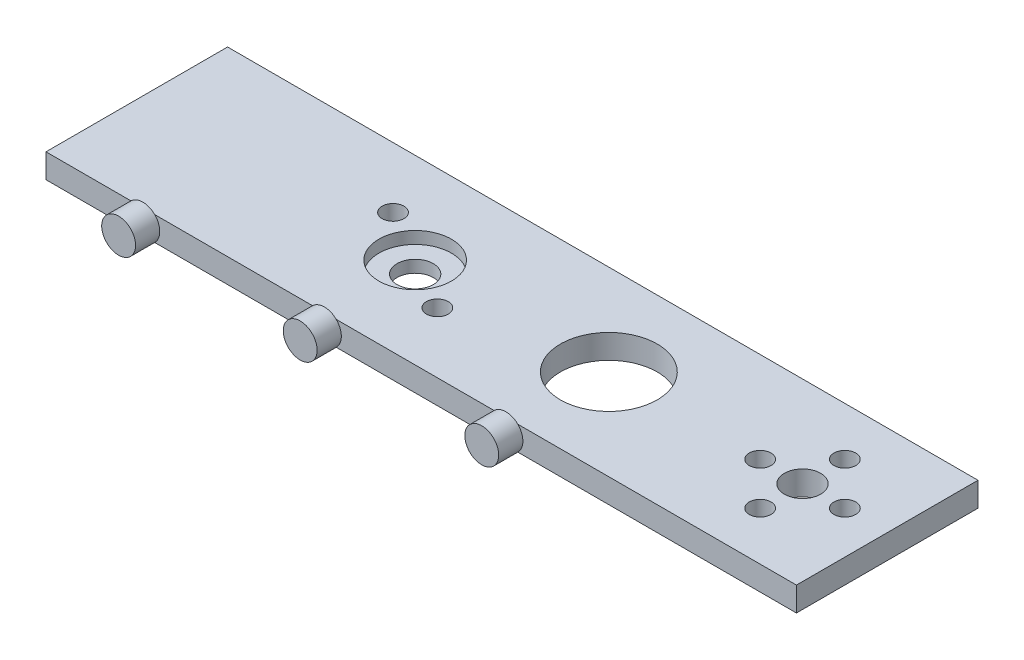
ISO-10303-21;
HEADER;
FILE_DESCRIPTION(('STEP AP214'),'2;1');
FILE_NAME('part.step','',(''),(''),'','','');
FILE_SCHEMA(('AUTOMOTIVE_DESIGN { 1 0 10303 214 1 1 1 1 }'));
ENDSEC;
DATA;
#1=APPLICATION_CONTEXT('core data for automotive mechanical design processes');
#2=APPLICATION_PROTOCOL_DEFINITION('international standard','automotive_design',2000,#1);
#3=PRODUCT_CONTEXT('',#1,'mechanical');
#4=PRODUCT('Part','Part','',(#3));
#5=PRODUCT_RELATED_PRODUCT_CATEGORY('part','',(#4));
#6=PRODUCT_DEFINITION_FORMATION('','',#4);
#7=PRODUCT_DEFINITION_CONTEXT('part definition',#1,'design');
#8=PRODUCT_DEFINITION('design','',#6,#7);
#9=PRODUCT_DEFINITION_SHAPE('','',#8);
#10=(LENGTH_UNIT() NAMED_UNIT(*) SI_UNIT(.MILLI.,.METRE.));
#11=(NAMED_UNIT(*) PLANE_ANGLE_UNIT() SI_UNIT($,.RADIAN.));
#12=(NAMED_UNIT(*) SI_UNIT($,.STERADIAN.) SOLID_ANGLE_UNIT());
#13=UNCERTAINTY_MEASURE_WITH_UNIT(LENGTH_MEASURE(1.E-05),#10,'distance_accuracy_value','');
#14=(GEOMETRIC_REPRESENTATION_CONTEXT(3) GLOBAL_UNCERTAINTY_ASSIGNED_CONTEXT((#13)) GLOBAL_UNIT_ASSIGNED_CONTEXT((#10,
#11,#12)) REPRESENTATION_CONTEXT('',''));
#15=CARTESIAN_POINT('',(0.,0.,0.));
#16=DIRECTION('',(0.,0.,1.));
#17=DIRECTION('',(1.,0.,0.));
#18=AXIS2_PLACEMENT_3D('',#15,#16,#17);
#19=CARTESIAN_POINT('',(-8.,2.,0.));
#20=DIRECTION('',(0.,-1.,0.));
#21=DIRECTION('',(0.,0.,-1.));
#22=AXIS2_PLACEMENT_3D('',#19,#20,#21);
#23=CYLINDRICAL_SURFACE('',#22,1.5);
#24=CARTESIAN_POINT('',(-8.,0.,0.));
#25=DIRECTION('',(0.,1.,0.));
#26=DIRECTION('',(0.,0.,1.));
#27=AXIS2_PLACEMENT_3D('',#24,#25,#26);
#28=CIRCLE('',#27,1.5);
#29=CARTESIAN_POINT('',(-8.,0.,1.5));
#30=VERTEX_POINT('',#29);
#31=EDGE_CURVE('E250',#30,#30,#28,.T.);
#32=ORIENTED_EDGE('',*,*,#31,.F.);
#33=EDGE_LOOP('',(#32));
#34=FACE_BOUND('',#33,.T.);
#35=CARTESIAN_POINT('',(-8.,1.,0.));
#36=DIRECTION('',(0.,1.,0.));
#37=DIRECTION('',(0.,0.,1.));
#38=AXIS2_PLACEMENT_3D('',#35,#36,#37);
#39=CIRCLE('',#38,1.5);
#40=CARTESIAN_POINT('',(-8.,1.,1.5));
#41=VERTEX_POINT('',#40);
#42=EDGE_CURVE('E51',#41,#41,#39,.T.);
#43=ORIENTED_EDGE('',*,*,#42,.T.);
#44=EDGE_LOOP('',(#43));
#45=FACE_BOUND('',#44,.T.);
#46=ADVANCED_FACE('F47',(#34,#45),#23,.F.);
#47=CARTESIAN_POINT('',(0.,2.,7.5));
#48=DIRECTION('',(0.,0.,1.));
#49=DIRECTION('',(1.,0.,0.));
#50=AXIS2_PLACEMENT_3D('',#47,#48,#49);
#51=PLANE('',#50);
#52=CARTESIAN_POINT('',(-23.,1.,7.5));
#53=DIRECTION('',(0.,0.,1.));
#54=DIRECTION('',(1.,0.,0.));
#55=AXIS2_PLACEMENT_3D('',#52,#53,#54);
#56=CIRCLE('',#55,1.4);
#57=CARTESIAN_POINT('',(-23.9797958971133,2.,7.5));
#58=VERTEX_POINT('',#57);
#59=CARTESIAN_POINT('',(-23.9797958971133,0.,7.5));
#60=VERTEX_POINT('',#59);
#61=EDGE_CURVE('E11',#58,#60,#56,.T.);
#62=ORIENTED_EDGE('',*,*,#61,.F.);
#63=DIRECTION('',(-1.,0.,0.));
#64=VECTOR('',#63,1.);
#65=CARTESIAN_POINT('',(0.,2.,7.5));
#66=LINE('',#65,#64);
#67=CARTESIAN_POINT('',(-31.,2.,7.5));
#68=VERTEX_POINT('',#67);
#69=EDGE_CURVE('E140',#58,#68,#66,.T.);
#70=ORIENTED_EDGE('',*,*,#69,.T.);
#71=DIRECTION('',(0.,-1.,0.));
#72=VECTOR('',#71,1.);
#73=CARTESIAN_POINT('',(-31.,2.,7.5));
#74=LINE('',#73,#72);
#75=CARTESIAN_POINT('',(-31.,0.,7.5));
#76=VERTEX_POINT('',#75);
#77=EDGE_CURVE('E161',#68,#76,#74,.T.);
#78=ORIENTED_EDGE('',*,*,#77,.T.);
#79=DIRECTION('',(-1.,0.,0.));
#80=VECTOR('',#79,1.);
#81=CARTESIAN_POINT('',(0.,0.,7.5));
#82=LINE('',#81,#80);
#83=EDGE_CURVE('E258',#60,#76,#82,.T.);
#84=ORIENTED_EDGE('',*,*,#83,.F.);
#85=EDGE_LOOP('',(#62,#70,#78,#84));
#86=FACE_BOUND('',#85,.T.);
#87=ADVANCED_FACE('F284',(#86),#51,.T.);
#88=CARTESIAN_POINT('',(-22.0202041028867,0.,7.5));
#89=VERTEX_POINT('',#88);
#90=CARTESIAN_POINT('',(-22.0202041028867,2.,7.5));
#91=VERTEX_POINT('',#90);
#92=EDGE_CURVE('E57',#89,#91,#56,.T.);
#93=ORIENTED_EDGE('',*,*,#92,.F.);
#94=CARTESIAN_POINT('',(-8.97979589711327,0.,7.5));
#95=VERTEX_POINT('',#94);
#96=EDGE_CURVE('E310',#95,#89,#82,.T.);
#97=ORIENTED_EDGE('',*,*,#96,.F.);
#98=CARTESIAN_POINT('',(-8.,1.,7.5));
#99=DIRECTION('',(0.,0.,1.));
#100=DIRECTION('',(1.,0.,0.));
#101=AXIS2_PLACEMENT_3D('',#98,#99,#100);
#102=CIRCLE('',#101,1.4);
#103=CARTESIAN_POINT('',(-8.97979589711327,2.,7.5));
#104=VERTEX_POINT('',#103);
#105=EDGE_CURVE('E72',#104,#95,#102,.T.);
#106=ORIENTED_EDGE('',*,*,#105,.F.);
#107=EDGE_CURVE('E347',#104,#91,#66,.T.);
#108=ORIENTED_EDGE('',*,*,#107,.T.);
#109=EDGE_LOOP('',(#93,#97,#106,#108));
#110=FACE_BOUND('',#109,.T.);
#111=ADVANCED_FACE('F360',(#110),#51,.T.);
#112=CARTESIAN_POINT('',(-7.02020410288673,0.,7.5));
#113=VERTEX_POINT('',#112);
#114=CARTESIAN_POINT('',(-7.02020410288673,2.,7.5));
#115=VERTEX_POINT('',#114);
#116=EDGE_CURVE('E331',#113,#115,#102,.T.);
#117=ORIENTED_EDGE('',*,*,#116,.F.);
#118=CARTESIAN_POINT('',(6.02020410288673,0.,7.5));
#119=VERTEX_POINT('',#118);
#120=EDGE_CURVE('E304',#119,#113,#82,.T.);
#121=ORIENTED_EDGE('',*,*,#120,.F.);
#122=CARTESIAN_POINT('',(7.,1.,7.5));
#123=DIRECTION('',(0.,0.,1.));
#124=DIRECTION('',(1.,0.,0.));
#125=AXIS2_PLACEMENT_3D('',#122,#123,#124);
#126=CIRCLE('',#125,1.4);
#127=CARTESIAN_POINT('',(6.02020410288673,2.,7.5));
#128=VERTEX_POINT('',#127);
#129=EDGE_CURVE('E160',#128,#119,#126,.T.);
#130=ORIENTED_EDGE('',*,*,#129,.F.);
#131=EDGE_CURVE('E147',#128,#115,#66,.T.);
#132=ORIENTED_EDGE('',*,*,#131,.T.);
#133=EDGE_LOOP('',(#117,#121,#130,#132));
#134=FACE_BOUND('',#133,.T.);
#135=ADVANCED_FACE('F342',(#134),#51,.T.);
#136=CARTESIAN_POINT('',(-31.,2.,0.));
#137=DIRECTION('',(-1.,0.,0.));
#138=DIRECTION('',(0.,0.,1.));
#139=AXIS2_PLACEMENT_3D('',#136,#137,#138);
#140=PLANE('',#139);
#141=DIRECTION('',(0.,0.,-1.));
#142=VECTOR('',#141,1.);
#143=CARTESIAN_POINT('',(-31.,0.,0.));
#144=LINE('',#143,#142);
#145=CARTESIAN_POINT('',(-31.,0.,-7.5));
#146=VERTEX_POINT('',#145);
#147=EDGE_CURVE('E254',#76,#146,#144,.T.);
#148=ORIENTED_EDGE('',*,*,#147,.F.);
#149=ORIENTED_EDGE('',*,*,#77,.F.);
#150=DIRECTION('',(0.,0.,-1.));
#151=VECTOR('',#150,1.);
#152=CARTESIAN_POINT('',(-31.,2.,0.));
#153=LINE('',#152,#151);
#154=CARTESIAN_POINT('',(-31.,2.,-7.5));
#155=VERTEX_POINT('',#154);
#156=EDGE_CURVE('E206',#68,#155,#153,.T.);
#157=ORIENTED_EDGE('',*,*,#156,.T.);
#158=DIRECTION('',(0.,-1.,0.));
#159=VECTOR('',#158,1.);
#160=CARTESIAN_POINT('',(-31.,2.,-7.5));
#161=LINE('',#160,#159);
#162=EDGE_CURVE('E220',#155,#146,#161,.T.);
#163=ORIENTED_EDGE('',*,*,#162,.T.);
#164=EDGE_LOOP('',(#148,#149,#157,#163));
#165=FACE_BOUND('',#164,.T.);
#166=ADVANCED_FACE('F287',(#165),#140,.T.);
#167=CARTESIAN_POINT('',(7.97979589711327,0.,7.5));
#168=VERTEX_POINT('',#167);
#169=CARTESIAN_POINT('',(7.97979589711327,2.,7.5));
#170=VERTEX_POINT('',#169);
#171=EDGE_CURVE('E130',#168,#170,#126,.T.);
#172=ORIENTED_EDGE('',*,*,#171,.F.);
#173=CARTESIAN_POINT('',(31.,0.,7.5));
#174=VERTEX_POINT('',#173);
#175=EDGE_CURVE('E259',#174,#168,#82,.T.);
#176=ORIENTED_EDGE('',*,*,#175,.F.);
#177=DIRECTION('',(0.,-1.,0.));
#178=VECTOR('',#177,1.);
#179=CARTESIAN_POINT('',(31.,2.,7.5));
#180=LINE('',#179,#178);
#181=CARTESIAN_POINT('',(31.,2.,7.5));
#182=VERTEX_POINT('',#181);
#183=EDGE_CURVE('E132',#182,#174,#180,.T.);
#184=ORIENTED_EDGE('',*,*,#183,.F.);
#185=EDGE_CURVE('E125',#182,#170,#66,.T.);
#186=ORIENTED_EDGE('',*,*,#185,.T.);
#187=EDGE_LOOP('',(#172,#176,#184,#186));
#188=FACE_BOUND('',#187,.T.);
#189=ADVANCED_FACE('F127',(#188),#51,.T.);
#190=CARTESIAN_POINT('',(31.,2.,0.));
#191=DIRECTION('',(1.,0.,0.));
#192=DIRECTION('',(0.,0.,-1.));
#193=AXIS2_PLACEMENT_3D('',#190,#191,#192);
#194=PLANE('',#193);
#195=DIRECTION('',(0.,0.,1.));
#196=VECTOR('',#195,1.);
#197=CARTESIAN_POINT('',(31.,0.,0.));
#198=LINE('',#197,#196);
#199=CARTESIAN_POINT('',(31.,0.,-7.5));
#200=VERTEX_POINT('',#199);
#201=EDGE_CURVE('E262',#200,#174,#198,.T.);
#202=ORIENTED_EDGE('',*,*,#201,.F.);
#203=DIRECTION('',(0.,-1.,0.));
#204=VECTOR('',#203,1.);
#205=CARTESIAN_POINT('',(31.,2.,-7.5));
#206=LINE('',#205,#204);
#207=CARTESIAN_POINT('',(31.,2.,-7.5));
#208=VERTEX_POINT('',#207);
#209=EDGE_CURVE('E276',#208,#200,#206,.T.);
#210=ORIENTED_EDGE('',*,*,#209,.F.);
#211=DIRECTION('',(0.,0.,1.));
#212=VECTOR('',#211,1.);
#213=CARTESIAN_POINT('',(31.,2.,0.));
#214=LINE('',#213,#212);
#215=EDGE_CURVE('E137',#208,#182,#214,.T.);
#216=ORIENTED_EDGE('',*,*,#215,.T.);
#217=ORIENTED_EDGE('',*,*,#183,.T.);
#218=EDGE_LOOP('',(#202,#210,#216,#217));
#219=FACE_BOUND('',#218,.T.);
#220=ADVANCED_FACE('F297',(#219),#194,.T.);
#221=CARTESIAN_POINT('',(0.,2.,-7.5));
#222=DIRECTION('',(0.,0.,-1.));
#223=DIRECTION('',(-1.,0.,0.));
#224=AXIS2_PLACEMENT_3D('',#221,#222,#223);
#225=PLANE('',#224);
#226=DIRECTION('',(1.,0.,0.));
#227=VECTOR('',#226,1.);
#228=CARTESIAN_POINT('',(0.,0.,-7.5));
#229=LINE('',#228,#227);
#230=EDGE_CURVE('E267',#146,#200,#229,.T.);
#231=ORIENTED_EDGE('',*,*,#230,.F.);
#232=ORIENTED_EDGE('',*,*,#162,.F.);
#233=DIRECTION('',(1.,0.,0.));
#234=VECTOR('',#233,1.);
#235=CARTESIAN_POINT('',(0.,2.,-7.5));
#236=LINE('',#235,#234);
#237=EDGE_CURVE('E212',#155,#208,#236,.T.);
#238=ORIENTED_EDGE('',*,*,#237,.T.);
#239=ORIENTED_EDGE('',*,*,#209,.T.);
#240=EDGE_LOOP('',(#231,#232,#238,#239));
#241=FACE_BOUND('',#240,.T.);
#242=ADVANCED_FACE('F293',(#241),#225,.T.);
#243=CARTESIAN_POINT('',(8.,2.,0.));
#244=DIRECTION('',(0.,-1.,0.));
#245=DIRECTION('',(0.,0.,-1.));
#246=AXIS2_PLACEMENT_3D('',#243,#244,#245);
#247=CYLINDRICAL_SURFACE('',#246,4.);
#248=CARTESIAN_POINT('',(8.,2.,0.));
#249=DIRECTION('',(0.,1.,0.));
#250=DIRECTION('',(0.,0.,1.));
#251=AXIS2_PLACEMENT_3D('',#248,#249,#250);
#252=CIRCLE('',#251,4.);
#253=CARTESIAN_POINT('',(8.,2.,4.));
#254=VERTEX_POINT('',#253);
#255=EDGE_CURVE('E202',#254,#254,#252,.T.);
#256=ORIENTED_EDGE('',*,*,#255,.T.);
#257=EDGE_LOOP('',(#256));
#258=FACE_BOUND('',#257,.T.);
#259=CARTESIAN_POINT('',(8.,0.,0.));
#260=DIRECTION('',(0.,1.,0.));
#261=DIRECTION('',(0.,0.,1.));
#262=AXIS2_PLACEMENT_3D('',#259,#260,#261);
#263=CIRCLE('',#262,4.);
#264=CARTESIAN_POINT('',(8.,0.,4.));
#265=VERTEX_POINT('',#264);
#266=EDGE_CURVE('E246',#265,#265,#263,.T.);
#267=ORIENTED_EDGE('',*,*,#266,.F.);
#268=EDGE_LOOP('',(#267));
#269=FACE_BOUND('',#268,.T.);
#270=ADVANCED_FACE('F379',(#258,#269),#247,.F.);
#271=CARTESIAN_POINT('',(24.,2.,0.));
#272=DIRECTION('',(0.,-1.,0.));
#273=DIRECTION('',(0.,0.,-1.));
#274=AXIS2_PLACEMENT_3D('',#271,#272,#273);
#275=CYLINDRICAL_SURFACE('',#274,1.5);
#276=CARTESIAN_POINT('',(24.,2.,0.));
#277=DIRECTION('',(0.,1.,0.));
#278=DIRECTION('',(0.,0.,1.));
#279=AXIS2_PLACEMENT_3D('',#276,#277,#278);
#280=CIRCLE('',#279,1.5);
#281=CARTESIAN_POINT('',(24.,2.,1.5));
#282=VERTEX_POINT('',#281);
#283=EDGE_CURVE('E198',#282,#282,#280,.T.);
#284=ORIENTED_EDGE('',*,*,#283,.T.);
#285=EDGE_LOOP('',(#284));
#286=FACE_BOUND('',#285,.T.);
#287=CARTESIAN_POINT('',(24.,0.,0.));
#288=DIRECTION('',(0.,1.,0.));
#289=DIRECTION('',(0.,0.,1.));
#290=AXIS2_PLACEMENT_3D('',#287,#288,#289);
#291=CIRCLE('',#290,1.5);
#292=CARTESIAN_POINT('',(24.,0.,1.5));
#293=VERTEX_POINT('',#292);
#294=EDGE_CURVE('E242',#293,#293,#291,.T.);
#295=ORIENTED_EDGE('',*,*,#294,.F.);
#296=EDGE_LOOP('',(#295));
#297=FACE_BOUND('',#296,.T.);
#298=ADVANCED_FACE('F382',(#286,#297),#275,.F.);
#299=CARTESIAN_POINT('',(27.5,2.,0.));
#300=DIRECTION('',(0.,-1.,0.));
#301=DIRECTION('',(0.,0.,-1.));
#302=AXIS2_PLACEMENT_3D('',#299,#300,#301);
#303=CYLINDRICAL_SURFACE('',#302,0.9);
#304=CARTESIAN_POINT('',(27.5,2.,0.));
#305=DIRECTION('',(0.,1.,0.));
#306=DIRECTION('',(0.,0.,1.));
#307=AXIS2_PLACEMENT_3D('',#304,#305,#306);
#308=CIRCLE('',#307,0.9);
#309=CARTESIAN_POINT('',(27.5,2.,0.9));
#310=VERTEX_POINT('',#309);
#311=EDGE_CURVE('E194',#310,#310,#308,.T.);
#312=ORIENTED_EDGE('',*,*,#311,.T.);
#313=EDGE_LOOP('',(#312));
#314=FACE_BOUND('',#313,.T.);
#315=CARTESIAN_POINT('',(27.5,0.,0.));
#316=DIRECTION('',(0.,1.,0.));
#317=DIRECTION('',(0.,0.,1.));
#318=AXIS2_PLACEMENT_3D('',#315,#316,#317);
#319=CIRCLE('',#318,0.9);
#320=CARTESIAN_POINT('',(27.5,0.,0.9));
#321=VERTEX_POINT('',#320);
#322=EDGE_CURVE('E238',#321,#321,#319,.T.);
#323=ORIENTED_EDGE('',*,*,#322,.F.);
#324=EDGE_LOOP('',(#323));
#325=FACE_BOUND('',#324,.T.);
#326=ADVANCED_FACE('F386',(#314,#325),#303,.F.);
#327=CARTESIAN_POINT('',(24.,2.,3.5));
#328=DIRECTION('',(0.,-1.,0.));
#329=DIRECTION('',(0.,0.,-1.));
#330=AXIS2_PLACEMENT_3D('',#327,#328,#329);
#331=CYLINDRICAL_SURFACE('',#330,0.9);
#332=CARTESIAN_POINT('',(24.,2.,3.5));
#333=DIRECTION('',(0.,1.,0.));
#334=DIRECTION('',(0.,0.,1.));
#335=AXIS2_PLACEMENT_3D('',#332,#333,#334);
#336=CIRCLE('',#335,0.9);
#337=CARTESIAN_POINT('',(24.,2.,4.4));
#338=VERTEX_POINT('',#337);
#339=EDGE_CURVE('E190',#338,#338,#336,.T.);
#340=ORIENTED_EDGE('',*,*,#339,.T.);
#341=EDGE_LOOP('',(#340));
#342=FACE_BOUND('',#341,.T.);
#343=CARTESIAN_POINT('',(24.,0.,3.5));
#344=DIRECTION('',(0.,1.,0.));
#345=DIRECTION('',(0.,0.,1.));
#346=AXIS2_PLACEMENT_3D('',#343,#344,#345);
#347=CIRCLE('',#346,0.9);
#348=CARTESIAN_POINT('',(24.,0.,4.4));
#349=VERTEX_POINT('',#348);
#350=EDGE_CURVE('E234',#349,#349,#347,.T.);
#351=ORIENTED_EDGE('',*,*,#350,.F.);
#352=EDGE_LOOP('',(#351));
#353=FACE_BOUND('',#352,.T.);
#354=ADVANCED_FACE('F390',(#342,#353),#331,.F.);
#355=CARTESIAN_POINT('',(20.5,2.,0.));
#356=DIRECTION('',(0.,-1.,0.));
#357=DIRECTION('',(0.,0.,-1.));
#358=AXIS2_PLACEMENT_3D('',#355,#356,#357);
#359=CYLINDRICAL_SURFACE('',#358,0.9);
#360=CARTESIAN_POINT('',(20.5,2.,0.));
#361=DIRECTION('',(0.,1.,0.));
#362=DIRECTION('',(0.,0.,1.));
#363=AXIS2_PLACEMENT_3D('',#360,#361,#362);
#364=CIRCLE('',#363,0.9);
#365=CARTESIAN_POINT('',(20.5,2.,0.900000000000001));
#366=VERTEX_POINT('',#365);
#367=EDGE_CURVE('E186',#366,#366,#364,.T.);
#368=ORIENTED_EDGE('',*,*,#367,.T.);
#369=EDGE_LOOP('',(#368));
#370=FACE_BOUND('',#369,.T.);
#371=CARTESIAN_POINT('',(20.5,0.,0.));
#372=DIRECTION('',(0.,1.,0.));
#373=DIRECTION('',(0.,0.,1.));
#374=AXIS2_PLACEMENT_3D('',#371,#372,#373);
#375=CIRCLE('',#374,0.9);
#376=CARTESIAN_POINT('',(20.5,0.,0.900000000000001));
#377=VERTEX_POINT('',#376);
#378=EDGE_CURVE('E230',#377,#377,#375,.T.);
#379=ORIENTED_EDGE('',*,*,#378,.F.);
#380=EDGE_LOOP('',(#379));
#381=FACE_BOUND('',#380,.T.);
#382=ADVANCED_FACE('F394',(#370,#381),#359,.F.);
#383=CARTESIAN_POINT('',(24.,2.,-3.5));
#384=DIRECTION('',(0.,-1.,0.));
#385=DIRECTION('',(0.,0.,-1.));
#386=AXIS2_PLACEMENT_3D('',#383,#384,#385);
#387=CYLINDRICAL_SURFACE('',#386,0.9);
#388=CARTESIAN_POINT('',(24.,2.,-3.5));
#389=DIRECTION('',(0.,1.,0.));
#390=DIRECTION('',(0.,0.,1.));
#391=AXIS2_PLACEMENT_3D('',#388,#389,#390);
#392=CIRCLE('',#391,0.9);
#393=CARTESIAN_POINT('',(24.,2.,-2.6));
#394=VERTEX_POINT('',#393);
#395=EDGE_CURVE('E181',#394,#394,#392,.T.);
#396=ORIENTED_EDGE('',*,*,#395,.T.);
#397=EDGE_LOOP('',(#396));
#398=FACE_BOUND('',#397,.T.);
#399=CARTESIAN_POINT('',(24.,0.,-3.5));
#400=DIRECTION('',(0.,1.,0.));
#401=DIRECTION('',(0.,0.,1.));
#402=AXIS2_PLACEMENT_3D('',#399,#400,#401);
#403=CIRCLE('',#402,0.9);
#404=CARTESIAN_POINT('',(24.,0.,-2.6));
#405=VERTEX_POINT('',#404);
#406=EDGE_CURVE('E225',#405,#405,#403,.T.);
#407=ORIENTED_EDGE('',*,*,#406,.F.);
#408=EDGE_LOOP('',(#407));
#409=FACE_BOUND('',#408,.T.);
#410=ADVANCED_FACE('F397',(#398,#409),#387,.F.);
#411=CARTESIAN_POINT('',(-12.3301270189222,2.,-2.50000000000001));
#412=DIRECTION('',(0.,-1.,0.));
#413=DIRECTION('',(0.,0.,-1.));
#414=AXIS2_PLACEMENT_3D('',#411,#412,#413);
#415=CYLINDRICAL_SURFACE('',#414,0.9);
#416=CARTESIAN_POINT('',(-12.3301270189222,2.,-2.50000000000001));
#417=DIRECTION('',(0.,1.,0.));
#418=DIRECTION('',(0.,0.,1.));
#419=AXIS2_PLACEMENT_3D('',#416,#417,#418);
#420=CIRCLE('',#419,0.9);
#421=CARTESIAN_POINT('',(-12.3301270189222,2.,-1.60000000000001));
#422=VERTEX_POINT('',#421);
#423=EDGE_CURVE('E177',#422,#422,#420,.F.);
#424=ORIENTED_EDGE('',*,*,#423,.F.);
#425=EDGE_LOOP('',(#424));
#426=FACE_BOUND('',#425,.T.);
#427=CARTESIAN_POINT('',(-12.3301270189222,0.,-2.50000000000001));
#428=DIRECTION('',(0.,1.,0.));
#429=DIRECTION('',(0.,0.,1.));
#430=AXIS2_PLACEMENT_3D('',#427,#428,#429);
#431=CIRCLE('',#430,0.9);
#432=CARTESIAN_POINT('',(-12.3301270189222,0.,-1.60000000000001));
#433=VERTEX_POINT('',#432);
#434=EDGE_CURVE('E221',#433,#433,#431,.F.);
#435=ORIENTED_EDGE('',*,*,#434,.T.);
#436=EDGE_LOOP('',(#435));
#437=FACE_BOUND('',#436,.T.);
#438=ADVANCED_FACE('F49',(#426,#437),#415,.F.);
#439=CARTESIAN_POINT('',(-3.66987298107781,2.,2.50000000000001));
#440=DIRECTION('',(0.,-1.,0.));
#441=DIRECTION('',(0.,0.,-1.));
#442=AXIS2_PLACEMENT_3D('',#439,#440,#441);
#443=CYLINDRICAL_SURFACE('',#442,0.9);
#444=CARTESIAN_POINT('',(-3.66987298107781,2.,2.50000000000001));
#445=DIRECTION('',(0.,1.,0.));
#446=DIRECTION('',(0.,0.,1.));
#447=AXIS2_PLACEMENT_3D('',#444,#445,#446);
#448=CIRCLE('',#447,0.9);
#449=CARTESIAN_POINT('',(-3.66987298107781,2.,3.40000000000001));
#450=VERTEX_POINT('',#449);
#451=EDGE_CURVE('E216',#450,#450,#448,.F.);
#452=ORIENTED_EDGE('',*,*,#451,.F.);
#453=EDGE_LOOP('',(#452));
#454=FACE_BOUND('',#453,.T.);
#455=CARTESIAN_POINT('',(-3.66987298107781,0.,2.50000000000001));
#456=DIRECTION('',(0.,1.,0.));
#457=DIRECTION('',(0.,0.,1.));
#458=AXIS2_PLACEMENT_3D('',#455,#456,#457);
#459=CIRCLE('',#458,0.9);
#460=CARTESIAN_POINT('',(-3.66987298107781,0.,3.40000000000001));
#461=VERTEX_POINT('',#460);
#462=EDGE_CURVE('E182',#461,#461,#459,.F.);
#463=ORIENTED_EDGE('',*,*,#462,.T.);
#464=EDGE_LOOP('',(#463));
#465=FACE_BOUND('',#464,.T.);
#466=ADVANCED_FACE('F404',(#454,#465),#443,.F.);
#467=CARTESIAN_POINT('',(0.,2.,0.));
#468=DIRECTION('',(0.,1.,0.));
#469=DIRECTION('',(0.,0.,1.));
#470=AXIS2_PLACEMENT_3D('',#467,#468,#469);
#471=PLANE('',#470);
#472=CARTESIAN_POINT('',(-8.,2.,0.));
#473=DIRECTION('',(0.,1.,0.));
#474=DIRECTION('',(0.,0.,1.));
#475=AXIS2_PLACEMENT_3D('',#472,#473,#474);
#476=CIRCLE('',#475,3.);
#477=CARTESIAN_POINT('',(-8.,2.,3.));
#478=VERTEX_POINT('',#477);
#479=EDGE_CURVE('E674',#478,#478,#476,.T.);
#480=ORIENTED_EDGE('',*,*,#479,.F.);
#481=EDGE_LOOP('',(#480));
#482=FACE_BOUND('',#481,.T.);
#483=ORIENTED_EDGE('',*,*,#423,.T.);
#484=EDGE_LOOP('',(#483));
#485=FACE_BOUND('',#484,.T.);
#486=ORIENTED_EDGE('',*,*,#395,.F.);
#487=EDGE_LOOP('',(#486));
#488=FACE_BOUND('',#487,.T.);
#489=ORIENTED_EDGE('',*,*,#367,.F.);
#490=EDGE_LOOP('',(#489));
#491=FACE_BOUND('',#490,.T.);
#492=ORIENTED_EDGE('',*,*,#339,.F.);
#493=EDGE_LOOP('',(#492));
#494=FACE_BOUND('',#493,.T.);
#495=ORIENTED_EDGE('',*,*,#311,.F.);
#496=EDGE_LOOP('',(#495));
#497=FACE_BOUND('',#496,.T.);
#498=ORIENTED_EDGE('',*,*,#283,.F.);
#499=EDGE_LOOP('',(#498));
#500=FACE_BOUND('',#499,.T.);
#501=ORIENTED_EDGE('',*,*,#255,.F.);
#502=EDGE_LOOP('',(#501));
#503=FACE_BOUND('',#502,.T.);
#504=ORIENTED_EDGE('',*,*,#156,.F.);
#505=ORIENTED_EDGE('',*,*,#69,.F.);
#506=EDGE_CURVE('E351',#91,#58,#66,.T.);
#507=ORIENTED_EDGE('',*,*,#506,.F.);
#508=ORIENTED_EDGE('',*,*,#107,.F.);
#509=EDGE_CURVE('E344',#115,#104,#66,.T.);
#510=ORIENTED_EDGE('',*,*,#509,.F.);
#511=ORIENTED_EDGE('',*,*,#131,.F.);
#512=EDGE_CURVE('E138',#170,#128,#66,.T.);
#513=ORIENTED_EDGE('',*,*,#512,.F.);
#514=ORIENTED_EDGE('',*,*,#185,.F.);
#515=ORIENTED_EDGE('',*,*,#215,.F.);
#516=ORIENTED_EDGE('',*,*,#237,.F.);
#517=EDGE_LOOP('',(#504,#505,#507,#508,#510,#511,#513,#514,#515,#516));
#518=FACE_BOUND('',#517,.T.);
#519=ORIENTED_EDGE('',*,*,#451,.T.);
#520=EDGE_LOOP('',(#519));
#521=FACE_BOUND('',#520,.T.);
#522=ADVANCED_FACE('F144',(#482,#485,#488,#491,#494,#497,#500,#503,#518,#521),#471,.T.);
#523=CARTESIAN_POINT('',(0.,0.,0.));
#524=DIRECTION('',(0.,1.,0.));
#525=DIRECTION('',(0.,0.,1.));
#526=AXIS2_PLACEMENT_3D('',#523,#524,#525);
#527=PLANE('',#526);
#528=ORIENTED_EDGE('',*,*,#434,.F.);
#529=EDGE_LOOP('',(#528));
#530=FACE_BOUND('',#529,.T.);
#531=ORIENTED_EDGE('',*,*,#406,.T.);
#532=EDGE_LOOP('',(#531));
#533=FACE_BOUND('',#532,.T.);
#534=ORIENTED_EDGE('',*,*,#378,.T.);
#535=EDGE_LOOP('',(#534));
#536=FACE_BOUND('',#535,.T.);
#537=ORIENTED_EDGE('',*,*,#350,.T.);
#538=EDGE_LOOP('',(#537));
#539=FACE_BOUND('',#538,.T.);
#540=ORIENTED_EDGE('',*,*,#322,.T.);
#541=EDGE_LOOP('',(#540));
#542=FACE_BOUND('',#541,.T.);
#543=ORIENTED_EDGE('',*,*,#294,.T.);
#544=EDGE_LOOP('',(#543));
#545=FACE_BOUND('',#544,.T.);
#546=ORIENTED_EDGE('',*,*,#266,.T.);
#547=EDGE_LOOP('',(#546));
#548=FACE_BOUND('',#547,.T.);
#549=ORIENTED_EDGE('',*,*,#31,.T.);
#550=EDGE_LOOP('',(#549));
#551=FACE_BOUND('',#550,.T.);
#552=ORIENTED_EDGE('',*,*,#147,.T.);
#553=ORIENTED_EDGE('',*,*,#230,.T.);
#554=ORIENTED_EDGE('',*,*,#201,.T.);
#555=ORIENTED_EDGE('',*,*,#175,.T.);
#556=EDGE_CURVE('E263',#168,#119,#82,.T.);
#557=ORIENTED_EDGE('',*,*,#556,.T.);
#558=ORIENTED_EDGE('',*,*,#120,.T.);
#559=EDGE_CURVE('E306',#113,#95,#82,.T.);
#560=ORIENTED_EDGE('',*,*,#559,.T.);
#561=ORIENTED_EDGE('',*,*,#96,.T.);
#562=EDGE_CURVE('E314',#89,#60,#82,.T.);
#563=ORIENTED_EDGE('',*,*,#562,.T.);
#564=ORIENTED_EDGE('',*,*,#83,.T.);
#565=EDGE_LOOP('',(#552,#553,#554,#555,#557,#558,#560,#561,#563,#564));
#566=FACE_BOUND('',#565,.T.);
#567=ORIENTED_EDGE('',*,*,#462,.F.);
#568=EDGE_LOOP('',(#567));
#569=FACE_BOUND('',#568,.T.);
#570=ADVANCED_FACE('F290',(#530,#533,#536,#539,#542,#545,#548,#551,#566,#569),#527,.F.);
#571=CARTESIAN_POINT('',(7.,1.,7.5));
#572=DIRECTION('',(0.,0.,1.));
#573=DIRECTION('',(1.,0.,0.));
#574=AXIS2_PLACEMENT_3D('',#571,#572,#573);
#575=PLANE('',#574);
#576=EDGE_CURVE('E156',#170,#128,#126,.T.);
#577=ORIENTED_EDGE('',*,*,#576,.F.);
#578=ORIENTED_EDGE('',*,*,#512,.T.);
#579=EDGE_LOOP('',(#577,#578));
#580=FACE_BOUND('',#579,.T.);
#581=ADVANCED_FACE('F163',(#580),#575,.F.);
#582=CARTESIAN_POINT('',(7.,1.,9.5));
#583=DIRECTION('',(0.,0.,-1.));
#584=DIRECTION('',(-1.,0.,0.));
#585=AXIS2_PLACEMENT_3D('',#582,#583,#584);
#586=CYLINDRICAL_SURFACE('',#585,1.4);
#587=CARTESIAN_POINT('',(7.,1.,9.5));
#588=DIRECTION('',(0.,0.,1.));
#589=DIRECTION('',(1.,0.,0.));
#590=AXIS2_PLACEMENT_3D('',#587,#588,#589);
#591=CIRCLE('',#590,1.4);
#592=CARTESIAN_POINT('',(8.4,1.,9.5));
#593=VERTEX_POINT('',#592);
#594=EDGE_CURVE('E171',#593,#593,#591,.T.);
#595=ORIENTED_EDGE('',*,*,#594,.F.);
#596=EDGE_LOOP('',(#595));
#597=FACE_BOUND('',#596,.T.);
#598=ORIENTED_EDGE('',*,*,#576,.T.);
#599=ORIENTED_EDGE('',*,*,#129,.T.);
#600=EDGE_CURVE('E158',#119,#168,#126,.T.);
#601=ORIENTED_EDGE('',*,*,#600,.T.);
#602=ORIENTED_EDGE('',*,*,#171,.T.);
#603=EDGE_LOOP('',(#598,#599,#601,#602));
#604=FACE_BOUND('',#603,.T.);
#605=ADVANCED_FACE('F154',(#597,#604),#586,.T.);
#606=CARTESIAN_POINT('',(7.,1.,9.5));
#607=DIRECTION('',(0.,0.,1.));
#608=DIRECTION('',(1.,0.,0.));
#609=AXIS2_PLACEMENT_3D('',#606,#607,#608);
#610=PLANE('',#609);
#611=ORIENTED_EDGE('',*,*,#594,.T.);
#612=EDGE_LOOP('',(#611));
#613=FACE_BOUND('',#612,.T.);
#614=ADVANCED_FACE('F552',(#613),#610,.T.);
#615=ORIENTED_EDGE('',*,*,#556,.F.);
#616=ORIENTED_EDGE('',*,*,#600,.F.);
#617=EDGE_LOOP('',(#615,#616));
#618=FACE_BOUND('',#617,.T.);
#619=ADVANCED_FACE('F302',(#618),#575,.F.);
#620=CARTESIAN_POINT('',(-8.,1.,7.5));
#621=DIRECTION('',(0.,0.,1.));
#622=DIRECTION('',(1.,0.,0.));
#623=AXIS2_PLACEMENT_3D('',#620,#621,#622);
#624=PLANE('',#623);
#625=EDGE_CURVE('E328',#115,#104,#102,.T.);
#626=ORIENTED_EDGE('',*,*,#625,.F.);
#627=ORIENTED_EDGE('',*,*,#509,.T.);
#628=EDGE_LOOP('',(#626,#627));
#629=FACE_BOUND('',#628,.T.);
#630=ADVANCED_FACE('F570',(#629),#624,.F.);
#631=CARTESIAN_POINT('',(-8.,1.,9.5));
#632=DIRECTION('',(0.,0.,-1.));
#633=DIRECTION('',(-1.,0.,0.));
#634=AXIS2_PLACEMENT_3D('',#631,#632,#633);
#635=CYLINDRICAL_SURFACE('',#634,1.4);
#636=CARTESIAN_POINT('',(-8.,1.,9.5));
#637=DIRECTION('',(0.,0.,1.));
#638=DIRECTION('',(1.,0.,0.));
#639=AXIS2_PLACEMENT_3D('',#636,#637,#638);
#640=CIRCLE('',#639,1.4);
#641=CARTESIAN_POINT('',(-6.6,1.,9.5));
#642=VERTEX_POINT('',#641);
#643=EDGE_CURVE('E165',#642,#642,#640,.T.);
#644=ORIENTED_EDGE('',*,*,#643,.F.);
#645=EDGE_LOOP('',(#644));
#646=FACE_BOUND('',#645,.T.);
#647=ORIENTED_EDGE('',*,*,#625,.T.);
#648=ORIENTED_EDGE('',*,*,#105,.T.);
#649=EDGE_CURVE('E169',#95,#113,#102,.T.);
#650=ORIENTED_EDGE('',*,*,#649,.T.);
#651=ORIENTED_EDGE('',*,*,#116,.T.);
#652=EDGE_LOOP('',(#647,#648,#650,#651));
#653=FACE_BOUND('',#652,.T.);
#654=ADVANCED_FACE('F578',(#646,#653),#635,.T.);
#655=CARTESIAN_POINT('',(-8.,1.,9.5));
#656=DIRECTION('',(0.,0.,1.));
#657=DIRECTION('',(1.,0.,0.));
#658=AXIS2_PLACEMENT_3D('',#655,#656,#657);
#659=PLANE('',#658);
#660=ORIENTED_EDGE('',*,*,#643,.T.);
#661=EDGE_LOOP('',(#660));
#662=FACE_BOUND('',#661,.T.);
#663=ADVANCED_FACE('F588',(#662),#659,.T.);
#664=ORIENTED_EDGE('',*,*,#559,.F.);
#665=ORIENTED_EDGE('',*,*,#649,.F.);
#666=EDGE_LOOP('',(#664,#665));
#667=FACE_BOUND('',#666,.T.);
#668=ADVANCED_FACE('F580',(#667),#624,.F.);
#669=CARTESIAN_POINT('',(-23.,1.,7.5));
#670=DIRECTION('',(0.,0.,1.));
#671=DIRECTION('',(1.,0.,0.));
#672=AXIS2_PLACEMENT_3D('',#669,#670,#671);
#673=PLANE('',#672);
#674=EDGE_CURVE('E322',#91,#58,#56,.T.);
#675=ORIENTED_EDGE('',*,*,#674,.F.);
#676=ORIENTED_EDGE('',*,*,#506,.T.);
#677=EDGE_LOOP('',(#675,#676));
#678=FACE_BOUND('',#677,.T.);
#679=ADVANCED_FACE('F357',(#678),#673,.F.);
#680=CARTESIAN_POINT('',(-23.,1.,9.5));
#681=DIRECTION('',(0.,0.,-1.));
#682=DIRECTION('',(-1.,0.,0.));
#683=AXIS2_PLACEMENT_3D('',#680,#681,#682);
#684=CYLINDRICAL_SURFACE('',#683,1.4);
#685=CARTESIAN_POINT('',(-23.,1.,9.5));
#686=DIRECTION('',(0.,0.,1.));
#687=DIRECTION('',(1.,0.,0.));
#688=AXIS2_PLACEMENT_3D('',#685,#686,#687);
#689=CIRCLE('',#688,1.4);
#690=CARTESIAN_POINT('',(-21.6,1.,9.5));
#691=VERTEX_POINT('',#690);
#692=EDGE_CURVE('E226',#691,#691,#689,.T.);
#693=ORIENTED_EDGE('',*,*,#692,.F.);
#694=EDGE_LOOP('',(#693));
#695=FACE_BOUND('',#694,.T.);
#696=ORIENTED_EDGE('',*,*,#674,.T.);
#697=ORIENTED_EDGE('',*,*,#61,.T.);
#698=EDGE_CURVE('E59',#60,#89,#56,.T.);
#699=ORIENTED_EDGE('',*,*,#698,.T.);
#700=ORIENTED_EDGE('',*,*,#92,.T.);
#701=EDGE_LOOP('',(#696,#697,#699,#700));
#702=FACE_BOUND('',#701,.T.);
#703=ADVANCED_FACE('F359',(#695,#702),#684,.T.);
#704=CARTESIAN_POINT('',(-23.,1.,9.5));
#705=DIRECTION('',(0.,0.,1.));
#706=DIRECTION('',(1.,0.,0.));
#707=AXIS2_PLACEMENT_3D('',#704,#705,#706);
#708=PLANE('',#707);
#709=ORIENTED_EDGE('',*,*,#692,.T.);
#710=EDGE_LOOP('',(#709));
#711=FACE_BOUND('',#710,.T.);
#712=ADVANCED_FACE('F624',(#711),#708,.T.);
#713=ORIENTED_EDGE('',*,*,#562,.F.);
#714=ORIENTED_EDGE('',*,*,#698,.F.);
#715=EDGE_LOOP('',(#713,#714));
#716=FACE_BOUND('',#715,.T.);
#717=ADVANCED_FACE('F616',(#716),#673,.F.);
#718=CARTESIAN_POINT('',(-8.,1.,0.));
#719=DIRECTION('',(0.,1.,0.));
#720=DIRECTION('',(0.,0.,1.));
#721=AXIS2_PLACEMENT_3D('',#718,#719,#720);
#722=CYLINDRICAL_SURFACE('',#721,3.);
#723=CARTESIAN_POINT('',(-8.,1.,0.));
#724=DIRECTION('',(0.,1.,0.));
#725=DIRECTION('',(0.,0.,1.));
#726=AXIS2_PLACEMENT_3D('',#723,#724,#725);
#727=CIRCLE('',#726,3.);
#728=CARTESIAN_POINT('',(-8.,1.,3.));
#729=VERTEX_POINT('',#728);
#730=EDGE_CURVE('E672',#729,#729,#727,.T.);
#731=ORIENTED_EDGE('',*,*,#730,.F.);
#732=EDGE_LOOP('',(#731));
#733=FACE_BOUND('',#732,.T.);
#734=ORIENTED_EDGE('',*,*,#479,.T.);
#735=EDGE_LOOP('',(#734));
#736=FACE_BOUND('',#735,.T.);
#737=ADVANCED_FACE('F642',(#733,#736),#722,.F.);
#738=CARTESIAN_POINT('',(-8.,1.,0.));
#739=DIRECTION('',(0.,1.,0.));
#740=DIRECTION('',(0.,0.,1.));
#741=AXIS2_PLACEMENT_3D('',#738,#739,#740);
#742=PLANE('',#741);
#743=ORIENTED_EDGE('',*,*,#42,.F.);
#744=EDGE_LOOP('',(#743));
#745=FACE_BOUND('',#744,.T.);
#746=ORIENTED_EDGE('',*,*,#730,.T.);
#747=EDGE_LOOP('',(#746));
#748=FACE_BOUND('',#747,.T.);
#749=ADVANCED_FACE('F654',(#745,#748),#742,.T.);
#750=CLOSED_SHELL('',(#46,#87,#111,#135,#166,#189,#220,#242,#270,#298,#326,#354,#382,#410,#438,
#466,#522,#570,#581,#605,#614,#619,#630,#654,#663,#668,#679,#703,#712,#717,#737,#749));
#751=MANIFOLD_SOLID_BREP('B2',#750);
#752=ADVANCED_BREP_SHAPE_REPRESENTATION('',(#18,#751),#14);
#753=SHAPE_DEFINITION_REPRESENTATION(#9,#752);
ENDSEC;
END-ISO-10303-21;
